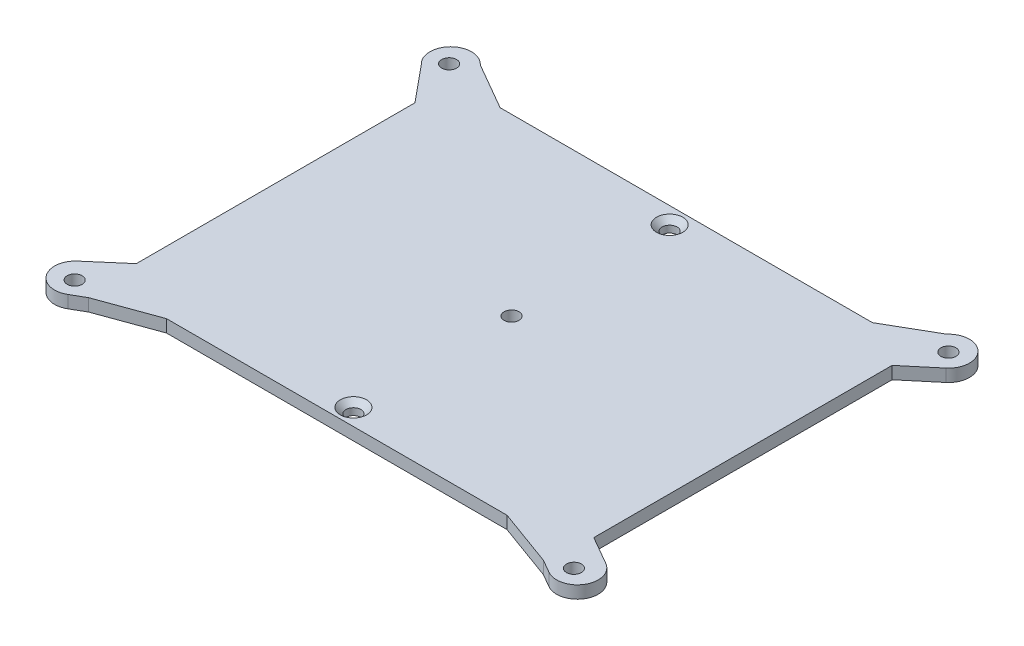
ISO-10303-21;
HEADER;
FILE_DESCRIPTION(('STEP AP214'),'2;1');
FILE_NAME('part.step','',(''),(''),'','','');
FILE_SCHEMA(('AUTOMOTIVE_DESIGN { 1 0 10303 214 1 1 1 1 }'));
ENDSEC;
DATA;
#1=APPLICATION_CONTEXT('core data for automotive mechanical design processes');
#2=APPLICATION_PROTOCOL_DEFINITION('international standard','automotive_design',2000,#1);
#3=PRODUCT_CONTEXT('',#1,'mechanical');
#4=PRODUCT('Part','Part','',(#3));
#5=PRODUCT_RELATED_PRODUCT_CATEGORY('part','',(#4));
#6=PRODUCT_DEFINITION_FORMATION('','',#4);
#7=PRODUCT_DEFINITION_CONTEXT('part definition',#1,'design');
#8=PRODUCT_DEFINITION('design','',#6,#7);
#9=PRODUCT_DEFINITION_SHAPE('','',#8);
#10=(LENGTH_UNIT() NAMED_UNIT(*) SI_UNIT(.MILLI.,.METRE.));
#11=(NAMED_UNIT(*) PLANE_ANGLE_UNIT() SI_UNIT($,.RADIAN.));
#12=(NAMED_UNIT(*) SI_UNIT($,.STERADIAN.) SOLID_ANGLE_UNIT());
#13=UNCERTAINTY_MEASURE_WITH_UNIT(LENGTH_MEASURE(1.E-05),#10,'distance_accuracy_value','');
#14=(GEOMETRIC_REPRESENTATION_CONTEXT(3) GLOBAL_UNCERTAINTY_ASSIGNED_CONTEXT((#13)) GLOBAL_UNIT_ASSIGNED_CONTEXT((#10,
#11,#12)) REPRESENTATION_CONTEXT('',''));
#15=CARTESIAN_POINT('',(0.,0.,0.));
#16=DIRECTION('',(0.,0.,1.));
#17=DIRECTION('',(1.,0.,0.));
#18=AXIS2_PLACEMENT_3D('',#15,#16,#17);
#19=CARTESIAN_POINT('',(0.,3.,0.));
#20=DIRECTION('',(0.,-1.,0.));
#21=DIRECTION('',(0.,0.,-1.));
#22=AXIS2_PLACEMENT_3D('',#19,#20,#21);
#23=PLANE('',#22);
#24=CARTESIAN_POINT('',(0.,3.,-38.));
#25=DIRECTION('',(0.,1.,0.));
#26=DIRECTION('',(0.,0.,1.));
#27=AXIS2_PLACEMENT_3D('',#24,#25,#26);
#28=CIRCLE('',#27,3.15);
#29=CARTESIAN_POINT('',(0.,3.,-34.85));
#30=VERTEX_POINT('',#29);
#31=EDGE_CURVE('E884',#30,#30,#28,.T.);
#32=ORIENTED_EDGE('',*,*,#31,.F.);
#33=EDGE_LOOP('',(#32));
#34=FACE_BOUND('',#33,.T.);
#35=CARTESIAN_POINT('',(0.,3.,38.));
#36=DIRECTION('',(0.,1.,0.));
#37=DIRECTION('',(0.,0.,1.));
#38=AXIS2_PLACEMENT_3D('',#35,#36,#37);
#39=CIRCLE('',#38,3.15);
#40=CARTESIAN_POINT('',(0.,3.,41.15));
#41=VERTEX_POINT('',#40);
#42=EDGE_CURVE('E348',#41,#41,#39,.T.);
#43=ORIENTED_EDGE('',*,*,#42,.F.);
#44=EDGE_LOOP('',(#43));
#45=FACE_BOUND('',#44,.T.);
#46=CARTESIAN_POINT('',(0.,3.,0.));
#47=DIRECTION('',(0.,1.,0.));
#48=DIRECTION('',(0.,0.,1.));
#49=AXIS2_PLACEMENT_3D('',#46,#47,#48);
#50=CIRCLE('',#49,1.8);
#51=CARTESIAN_POINT('',(0.,3.,1.8));
#52=VERTEX_POINT('',#51);
#53=EDGE_CURVE('E340',#52,#52,#50,.T.);
#54=ORIENTED_EDGE('',*,*,#53,.F.);
#55=EDGE_LOOP('',(#54));
#56=FACE_BOUND('',#55,.T.);
#57=CARTESIAN_POINT('',(-60.,3.,-45.));
#58=DIRECTION('',(0.,1.,0.));
#59=DIRECTION('',(0.,0.,1.));
#60=AXIS2_PLACEMENT_3D('',#57,#58,#59);
#61=CIRCLE('',#60,1.8);
#62=CARTESIAN_POINT('',(-60.,3.,-43.2));
#63=VERTEX_POINT('',#62);
#64=EDGE_CURVE('E358',#63,#63,#61,.T.);
#65=ORIENTED_EDGE('',*,*,#64,.F.);
#66=EDGE_LOOP('',(#65));
#67=FACE_BOUND('',#66,.T.);
#68=CARTESIAN_POINT('',(60.,3.,45.));
#69=DIRECTION('',(0.,1.,0.));
#70=DIRECTION('',(0.,0.,1.));
#71=AXIS2_PLACEMENT_3D('',#68,#69,#70);
#72=CIRCLE('',#71,1.8);
#73=CARTESIAN_POINT('',(60.,3.,46.8));
#74=VERTEX_POINT('',#73);
#75=EDGE_CURVE('E364',#74,#74,#72,.T.);
#76=ORIENTED_EDGE('',*,*,#75,.F.);
#77=EDGE_LOOP('',(#76));
#78=FACE_BOUND('',#77,.T.);
#79=CARTESIAN_POINT('',(-60.,3.,45.));
#80=DIRECTION('',(0.,1.,0.));
#81=DIRECTION('',(0.,0.,1.));
#82=AXIS2_PLACEMENT_3D('',#79,#80,#81);
#83=CIRCLE('',#82,1.8);
#84=CARTESIAN_POINT('',(-60.,3.,46.8));
#85=VERTEX_POINT('',#84);
#86=EDGE_CURVE('E336',#85,#85,#83,.T.);
#87=ORIENTED_EDGE('',*,*,#86,.F.);
#88=EDGE_LOOP('',(#87));
#89=FACE_BOUND('',#88,.T.);
#90=DIRECTION('',(-0.866025403784442,0.,-0.499999999999995));
#91=VECTOR('',#90,1.);
#92=CARTESIAN_POINT('',(48.9737205583711,3.,32.1698729810779));
#93=LINE('',#92,#91);
#94=CARTESIAN_POINT('',(62.8301270189222,3.,40.1698729810778));
#95=VERTEX_POINT('',#94);
#96=CARTESIAN_POINT('',(56.,3.,36.2264973081038));
#97=VERTEX_POINT('',#96);
#98=EDGE_CURVE('E184',#95,#97,#93,.T.);
#99=ORIENTED_EDGE('',*,*,#98,.T.);
#100=DIRECTION('',(0.,0.,-1.));
#101=VECTOR('',#100,1.);
#102=CARTESIAN_POINT('',(56.,3.,42.));
#103=LINE('',#102,#101);
#104=CARTESIAN_POINT('',(56.,3.,-35.4729635533386));
#105=VERTEX_POINT('',#104);
#106=EDGE_CURVE('E267',#97,#105,#103,.T.);
#107=ORIENTED_EDGE('',*,*,#106,.T.);
#108=DIRECTION('',(0.766044443118976,0.,-0.642787609686542));
#109=VECTOR('',#108,1.);
#110=CARTESIAN_POINT('',(50.787449174124,3.,-31.0991140778532));
#111=LINE('',#110,#109);
#112=CARTESIAN_POINT('',(63.0441602640276,3.,-41.3837158328378));
#113=VERTEX_POINT('',#112);
#114=EDGE_CURVE('E224',#105,#113,#111,.T.);
#115=ORIENTED_EDGE('',*,*,#114,.T.);
#116=CARTESIAN_POINT('',(59.8302222155949,3.,-45.2139380484327));
#117=DIRECTION('',(0.,1.,0.));
#118=DIRECTION('',(0.,0.,-1.));
#119=AXIS2_PLACEMENT_3D('',#116,#117,#118);
#120=CIRCLE('',#119,5.);
#121=CARTESIAN_POINT('',(56.6162841671621,3.,-49.0441602640276));
#122=VERTEX_POINT('',#121);
#123=EDGE_CURVE('E221',#113,#122,#120,.T.);
#124=ORIENTED_EDGE('',*,*,#123,.T.);
#125=DIRECTION('',(-0.766044443118973,0.,0.642787609686545));
#126=VECTOR('',#125,1.);
#127=CARTESIAN_POINT('',(44.3595730772586,3.,-38.7595585090429));
#128=LINE('',#127,#126);
#129=CARTESIAN_POINT('',(55.8818252968878,3.,-48.4278760968655));
#130=VERTEX_POINT('',#129);
#131=EDGE_CURVE('E218',#122,#130,#128,.T.);
#132=ORIENTED_EDGE('',*,*,#131,.T.);
#133=DIRECTION('',(0.866025403784438,0.,-0.500000000000002));
#134=VECTOR('',#133,1.);
#135=CARTESIAN_POINT('',(-6.99942915138335,3.,-12.1233669141746));
#136=LINE('',#135,#134);
#137=CARTESIAN_POINT('',(44.7484173123593,3.,-42.));
#138=VERTEX_POINT('',#137);
#139=EDGE_CURVE('E325',#130,#138,#136,.F.);
#140=ORIENTED_EDGE('',*,*,#139,.T.);
#141=DIRECTION('',(-1.,0.,0.));
#142=VECTOR('',#141,1.);
#143=CARTESIAN_POINT('',(-56.,3.,-42.));
#144=LINE('',#143,#142);
#145=CARTESIAN_POINT('',(-44.7484173123593,3.,-42.));
#146=VERTEX_POINT('',#145);
#147=EDGE_CURVE('E269',#138,#146,#144,.T.);
#148=ORIENTED_EDGE('',*,*,#147,.T.);
#149=DIRECTION('',(-0.866025403784438,0.,-0.500000000000001));
#150=VECTOR('',#149,1.);
#151=CARTESIAN_POINT('',(6.99942915138337,3.,-12.1233669141747));
#152=LINE('',#151,#150);
#153=CARTESIAN_POINT('',(-55.8818252968878,3.,-48.4278760968655));
#154=VERTEX_POINT('',#153);
#155=EDGE_CURVE('E297',#146,#154,#152,.T.);
#156=ORIENTED_EDGE('',*,*,#155,.T.);
#157=DIRECTION('',(0.766044443118973,0.,0.642787609686545));
#158=VECTOR('',#157,1.);
#159=CARTESIAN_POINT('',(-44.3595730772586,3.,-38.7595585090429));
#160=LINE('',#159,#158);
#161=CARTESIAN_POINT('',(-56.6162841671621,3.,-49.0441602640276));
#162=VERTEX_POINT('',#161);
#163=EDGE_CURVE('E256',#162,#154,#160,.T.);
#164=ORIENTED_EDGE('',*,*,#163,.F.);
#165=CARTESIAN_POINT('',(-59.8302222155949,3.,-45.2139380484327));
#166=DIRECTION('',(0.,-1.,0.));
#167=DIRECTION('',(0.,0.,-1.));
#168=AXIS2_PLACEMENT_3D('',#165,#166,#167);
#169=CIRCLE('',#168,5.);
#170=CARTESIAN_POINT('',(-63.2263038604296,3.,-41.544247399125));
#171=VERTEX_POINT('',#170);
#172=EDGE_CURVE('E254',#171,#162,#169,.T.);
#173=ORIENTED_EDGE('',*,*,#172,.F.);
#174=DIRECTION('',(0.636920264158959,0.,0.770929683631187));
#175=VECTOR('',#174,1.);
#176=CARTESIAN_POINT('',(-17.178365107074,3.,14.1922785879535));
#177=LINE('',#176,#175);
#178=CARTESIAN_POINT('',(-56.,3.,-32.7975133690809));
#179=VERTEX_POINT('',#178);
#180=EDGE_CURVE('E318',#171,#179,#177,.T.);
#181=ORIENTED_EDGE('',*,*,#180,.T.);
#182=DIRECTION('',(0.,0.,1.));
#183=VECTOR('',#182,1.);
#184=CARTESIAN_POINT('',(-56.,3.,42.));
#185=LINE('',#184,#183);
#186=CARTESIAN_POINT('',(-56.,3.,34.1736987454082));
#187=VERTEX_POINT('',#186);
#188=EDGE_CURVE('E272',#179,#187,#185,.T.);
#189=ORIENTED_EDGE('',*,*,#188,.T.);
#190=DIRECTION('',(0.757734837258502,0.,-0.652562576619922));
#191=VECTOR('',#190,1.);
#192=CARTESIAN_POINT('',(-6.94907507956374,3.,-8.06904420076361));
#193=LINE('',#192,#191);
#194=CARTESIAN_POINT('',(-63.5134693843119,3.,40.6443118143819));
#195=VERTEX_POINT('',#194);
#196=EDGE_CURVE('E292',#187,#195,#193,.F.);
#197=ORIENTED_EDGE('',*,*,#196,.T.);
#198=CARTESIAN_POINT('',(-60.3301270189222,3.,44.5));
#199=DIRECTION('',(0.,-1.,0.));
#200=DIRECTION('',(0.,0.,-1.));
#201=AXIS2_PLACEMENT_3D('',#198,#199,#200);
#202=CIRCLE('',#201,5.);
#203=CARTESIAN_POINT('',(-57.8301270189222,3.,48.8301270189222));
#204=VERTEX_POINT('',#203);
#205=EDGE_CURVE('E243',#204,#195,#202,.T.);
#206=ORIENTED_EDGE('',*,*,#205,.F.);
#207=DIRECTION('',(-0.866025403784441,0.,0.499999999999995));
#208=VECTOR('',#207,1.);
#209=CARTESIAN_POINT('',(-43.9737205583712,3.,40.8301270189223));
#210=LINE('',#209,#208);
#211=CARTESIAN_POINT('',(-54.6602540378441,3.,46.9999999999999));
#212=VERTEX_POINT('',#211);
#213=EDGE_CURVE('E248',#212,#204,#210,.T.);
#214=ORIENTED_EDGE('',*,*,#213,.F.);
#215=DIRECTION('',(0.939692620785911,0.,-0.34202014332566));
#216=VECTOR('',#215,1.);
#217=CARTESIAN_POINT('',(8.71147374129264,3.,23.9345773943741));
#218=LINE('',#217,#216);
#219=CARTESIAN_POINT('',(-40.922866940571,3.,42.));
#220=VERTEX_POINT('',#219);
#221=EDGE_CURVE('E314',#212,#220,#218,.T.);
#222=ORIENTED_EDGE('',*,*,#221,.T.);
#223=DIRECTION('',(1.,0.,0.));
#224=VECTOR('',#223,1.);
#225=CARTESIAN_POINT('',(-56.,3.,42.));
#226=LINE('',#225,#224);
#227=CARTESIAN_POINT('',(40.922866940571,3.,42.));
#228=VERTEX_POINT('',#227);
#229=EDGE_CURVE('E274',#220,#228,#226,.T.);
#230=ORIENTED_EDGE('',*,*,#229,.T.);
#231=DIRECTION('',(-0.939692620785912,0.,-0.342020143325659));
#232=VECTOR('',#231,1.);
#233=CARTESIAN_POINT('',(-8.71147374129264,3.,23.9345773943742));
#234=LINE('',#233,#232);
#235=CARTESIAN_POINT('',(54.6602540378441,3.,46.9999999999998));
#236=VERTEX_POINT('',#235);
#237=EDGE_CURVE('E11',#228,#236,#234,.F.);
#238=ORIENTED_EDGE('',*,*,#237,.T.);
#239=DIRECTION('',(0.866025403784441,0.,0.499999999999995));
#240=VECTOR('',#239,1.);
#241=CARTESIAN_POINT('',(43.9737205583712,3.,40.8301270189223));
#242=LINE('',#241,#240);
#243=CARTESIAN_POINT('',(57.8301270189222,3.,48.8301270189222));
#244=VERTEX_POINT('',#243);
#245=EDGE_CURVE('E186',#236,#244,#242,.T.);
#246=ORIENTED_EDGE('',*,*,#245,.T.);
#247=CARTESIAN_POINT('',(60.3301270189222,3.,44.5));
#248=DIRECTION('',(0.,1.,0.));
#249=DIRECTION('',(0.,0.,-1.));
#250=AXIS2_PLACEMENT_3D('',#247,#248,#249);
#251=CIRCLE('',#250,5.);
#252=EDGE_CURVE('E180',#244,#95,#251,.T.);
#253=ORIENTED_EDGE('',*,*,#252,.T.);
#254=EDGE_LOOP('',(#99,#107,#115,#124,#132,#140,#148,#156,#164,#173,#181,#189,#197,#206,#214,
#222,#230,#238,#246,#253));
#255=FACE_BOUND('',#254,.T.);
#256=CARTESIAN_POINT('',(60.,3.,-45.));
#257=DIRECTION('',(0.,1.,0.));
#258=DIRECTION('',(0.,0.,1.));
#259=AXIS2_PLACEMENT_3D('',#256,#257,#258);
#260=CIRCLE('',#259,1.8);
#261=CARTESIAN_POINT('',(60.,3.,-43.2));
#262=VERTEX_POINT('',#261);
#263=EDGE_CURVE('E337',#262,#262,#260,.T.);
#264=ORIENTED_EDGE('',*,*,#263,.F.);
#265=EDGE_LOOP('',(#264));
#266=FACE_BOUND('',#265,.T.);
#267=ADVANCED_FACE('F40',(#34,#45,#56,#67,#78,#89,#255,#266),#23,.F.);
#268=CARTESIAN_POINT('',(56.,3.,42.));
#269=DIRECTION('',(-1.,0.,0.));
#270=DIRECTION('',(0.,0.,1.));
#271=AXIS2_PLACEMENT_3D('',#268,#269,#270);
#272=PLANE('',#271);
#273=DIRECTION('',(0.,1.,0.));
#274=VECTOR('',#273,1.);
#275=CARTESIAN_POINT('',(56.,3.,36.2264973081038));
#276=LINE('',#275,#274);
#277=CARTESIAN_POINT('',(56.,0.,36.2264973081038));
#278=VERTEX_POINT('',#277);
#279=EDGE_CURVE('E203',#278,#97,#276,.T.);
#280=ORIENTED_EDGE('',*,*,#279,.F.);
#281=DIRECTION('',(0.,0.,-1.));
#282=VECTOR('',#281,1.);
#283=CARTESIAN_POINT('',(56.,0.,42.));
#284=LINE('',#283,#282);
#285=CARTESIAN_POINT('',(56.,0.,-35.4729635533386));
#286=VERTEX_POINT('',#285);
#287=EDGE_CURVE('E266',#278,#286,#284,.T.);
#288=ORIENTED_EDGE('',*,*,#287,.T.);
#289=DIRECTION('',(0.,-1.,0.));
#290=VECTOR('',#289,1.);
#291=CARTESIAN_POINT('',(56.,3.,-35.4729635533386));
#292=LINE('',#291,#290);
#293=EDGE_CURVE('E235',#105,#286,#292,.T.);
#294=ORIENTED_EDGE('',*,*,#293,.F.);
#295=ORIENTED_EDGE('',*,*,#106,.F.);
#296=EDGE_LOOP('',(#280,#288,#294,#295));
#297=FACE_BOUND('',#296,.T.);
#298=ADVANCED_FACE('F390',(#297),#272,.F.);
#299=CARTESIAN_POINT('',(-56.,3.,42.));
#300=DIRECTION('',(0.,0.,-1.));
#301=DIRECTION('',(-1.,0.,0.));
#302=AXIS2_PLACEMENT_3D('',#299,#300,#301);
#303=PLANE('',#302);
#304=DIRECTION('',(1.,0.,0.));
#305=VECTOR('',#304,1.);
#306=CARTESIAN_POINT('',(-56.,0.,42.));
#307=LINE('',#306,#305);
#308=CARTESIAN_POINT('',(-40.922866940571,0.,42.));
#309=VERTEX_POINT('',#308);
#310=CARTESIAN_POINT('',(40.922866940571,0.,42.));
#311=VERTEX_POINT('',#310);
#312=EDGE_CURVE('E270',#309,#311,#307,.T.);
#313=ORIENTED_EDGE('',*,*,#312,.T.);
#314=DIRECTION('',(0.,1.,0.));
#315=VECTOR('',#314,1.);
#316=CARTESIAN_POINT('',(40.922866940571,3.,42.));
#317=LINE('',#316,#315);
#318=EDGE_CURVE('E64',#311,#228,#317,.T.);
#319=ORIENTED_EDGE('',*,*,#318,.T.);
#320=ORIENTED_EDGE('',*,*,#229,.F.);
#321=DIRECTION('',(0.,-1.,0.));
#322=VECTOR('',#321,1.);
#323=CARTESIAN_POINT('',(-40.922866940571,3.,42.));
#324=LINE('',#323,#322);
#325=EDGE_CURVE('E302',#220,#309,#324,.T.);
#326=ORIENTED_EDGE('',*,*,#325,.T.);
#327=EDGE_LOOP('',(#313,#319,#320,#326));
#328=FACE_BOUND('',#327,.T.);
#329=ADVANCED_FACE('F454',(#328),#303,.F.);
#330=CARTESIAN_POINT('',(-56.,3.,-42.));
#331=DIRECTION('',(0.,0.,1.));
#332=DIRECTION('',(1.,0.,0.));
#333=AXIS2_PLACEMENT_3D('',#330,#331,#332);
#334=PLANE('',#333);
#335=ORIENTED_EDGE('',*,*,#147,.F.);
#336=DIRECTION('',(0.,-1.,0.));
#337=VECTOR('',#336,1.);
#338=CARTESIAN_POINT('',(44.7484173123593,0.,-42.));
#339=LINE('',#338,#337);
#340=CARTESIAN_POINT('',(44.7484173123593,0.,-42.));
#341=VERTEX_POINT('',#340);
#342=EDGE_CURVE('E323',#138,#341,#339,.T.);
#343=ORIENTED_EDGE('',*,*,#342,.T.);
#344=DIRECTION('',(-1.,0.,0.));
#345=VECTOR('',#344,1.);
#346=CARTESIAN_POINT('',(-56.,0.,-42.));
#347=LINE('',#346,#345);
#348=CARTESIAN_POINT('',(-44.7484173123593,0.,-42.));
#349=VERTEX_POINT('',#348);
#350=EDGE_CURVE('E278',#341,#349,#347,.T.);
#351=ORIENTED_EDGE('',*,*,#350,.T.);
#352=DIRECTION('',(0.,1.,0.));
#353=VECTOR('',#352,1.);
#354=CARTESIAN_POINT('',(-44.7484173123593,3.,-42.));
#355=LINE('',#354,#353);
#356=EDGE_CURVE('E287',#349,#146,#355,.T.);
#357=ORIENTED_EDGE('',*,*,#356,.T.);
#358=EDGE_LOOP('',(#335,#343,#351,#357));
#359=FACE_BOUND('',#358,.T.);
#360=ADVANCED_FACE('F411',(#359),#334,.F.);
#361=CARTESIAN_POINT('',(-56.,3.,42.));
#362=DIRECTION('',(1.,0.,0.));
#363=DIRECTION('',(0.,0.,-1.));
#364=AXIS2_PLACEMENT_3D('',#361,#362,#363);
#365=PLANE('',#364);
#366=ORIENTED_EDGE('',*,*,#188,.F.);
#367=DIRECTION('',(0.,-1.,0.));
#368=VECTOR('',#367,1.);
#369=CARTESIAN_POINT('',(-56.,3.,-32.7975133690809));
#370=LINE('',#369,#368);
#371=CARTESIAN_POINT('',(-56.,0.,-32.7975133690809));
#372=VERTEX_POINT('',#371);
#373=EDGE_CURVE('E307',#179,#372,#370,.T.);
#374=ORIENTED_EDGE('',*,*,#373,.T.);
#375=DIRECTION('',(0.,0.,1.));
#376=VECTOR('',#375,1.);
#377=CARTESIAN_POINT('',(-56.,0.,42.));
#378=LINE('',#377,#376);
#379=CARTESIAN_POINT('',(-56.,0.,34.1736987454082));
#380=VERTEX_POINT('',#379);
#381=EDGE_CURVE('E280',#372,#380,#378,.T.);
#382=ORIENTED_EDGE('',*,*,#381,.T.);
#383=DIRECTION('',(0.,1.,0.));
#384=VECTOR('',#383,1.);
#385=CARTESIAN_POINT('',(-56.,3.,34.1736987454082));
#386=LINE('',#385,#384);
#387=EDGE_CURVE('E276',#380,#187,#386,.T.);
#388=ORIENTED_EDGE('',*,*,#387,.T.);
#389=EDGE_LOOP('',(#366,#374,#382,#388));
#390=FACE_BOUND('',#389,.T.);
#391=ADVANCED_FACE('F382',(#390),#365,.F.);
#392=CARTESIAN_POINT('',(0.,0.,0.));
#393=DIRECTION('',(0.,-1.,0.));
#394=DIRECTION('',(0.,0.,-1.));
#395=AXIS2_PLACEMENT_3D('',#392,#393,#394);
#396=PLANE('',#395);
#397=CARTESIAN_POINT('',(0.,0.,-38.));
#398=DIRECTION('',(0.,-1.,0.));
#399=DIRECTION('',(0.,0.,-1.));
#400=AXIS2_PLACEMENT_3D('',#397,#398,#399);
#401=CIRCLE('',#400,1.79999999999999);
#402=CARTESIAN_POINT('',(0.,0.,-39.8));
#403=VERTEX_POINT('',#402);
#404=EDGE_CURVE('E45',#403,#403,#401,.T.);
#405=ORIENTED_EDGE('',*,*,#404,.F.);
#406=EDGE_LOOP('',(#405));
#407=FACE_BOUND('',#406,.T.);
#408=CARTESIAN_POINT('',(0.,0.,38.));
#409=DIRECTION('',(0.,-1.,0.));
#410=DIRECTION('',(0.,0.,-1.));
#411=AXIS2_PLACEMENT_3D('',#408,#409,#410);
#412=CIRCLE('',#411,1.79999999999999);
#413=CARTESIAN_POINT('',(0.,0.,36.2));
#414=VERTEX_POINT('',#413);
#415=EDGE_CURVE('E338',#414,#414,#412,.T.);
#416=ORIENTED_EDGE('',*,*,#415,.F.);
#417=EDGE_LOOP('',(#416));
#418=FACE_BOUND('',#417,.T.);
#419=CARTESIAN_POINT('',(0.,0.,0.));
#420=DIRECTION('',(0.,-1.,0.));
#421=DIRECTION('',(0.,0.,-1.));
#422=AXIS2_PLACEMENT_3D('',#419,#420,#421);
#423=CIRCLE('',#422,1.8);
#424=CARTESIAN_POINT('',(0.,0.,-1.8));
#425=VERTEX_POINT('',#424);
#426=EDGE_CURVE('E345',#425,#425,#423,.T.);
#427=ORIENTED_EDGE('',*,*,#426,.F.);
#428=EDGE_LOOP('',(#427));
#429=FACE_BOUND('',#428,.T.);
#430=CARTESIAN_POINT('',(-60.,0.,-45.));
#431=DIRECTION('',(0.,-1.,0.));
#432=DIRECTION('',(0.,0.,-1.));
#433=AXIS2_PLACEMENT_3D('',#430,#431,#432);
#434=CIRCLE('',#433,1.8);
#435=CARTESIAN_POINT('',(-60.,0.,-46.8));
#436=VERTEX_POINT('',#435);
#437=EDGE_CURVE('E361',#436,#436,#434,.T.);
#438=ORIENTED_EDGE('',*,*,#437,.F.);
#439=EDGE_LOOP('',(#438));
#440=FACE_BOUND('',#439,.T.);
#441=CARTESIAN_POINT('',(60.,0.,45.));
#442=DIRECTION('',(0.,-1.,0.));
#443=DIRECTION('',(0.,0.,-1.));
#444=AXIS2_PLACEMENT_3D('',#441,#442,#443);
#445=CIRCLE('',#444,1.8);
#446=CARTESIAN_POINT('',(60.,0.,43.2));
#447=VERTEX_POINT('',#446);
#448=EDGE_CURVE('E367',#447,#447,#445,.T.);
#449=ORIENTED_EDGE('',*,*,#448,.F.);
#450=EDGE_LOOP('',(#449));
#451=FACE_BOUND('',#450,.T.);
#452=CARTESIAN_POINT('',(60.,0.,-45.));
#453=DIRECTION('',(0.,-1.,0.));
#454=DIRECTION('',(0.,0.,-1.));
#455=AXIS2_PLACEMENT_3D('',#452,#453,#454);
#456=CIRCLE('',#455,1.8);
#457=CARTESIAN_POINT('',(60.,0.,-46.8));
#458=VERTEX_POINT('',#457);
#459=EDGE_CURVE('E334',#458,#458,#456,.T.);
#460=ORIENTED_EDGE('',*,*,#459,.F.);
#461=EDGE_LOOP('',(#460));
#462=FACE_BOUND('',#461,.T.);
#463=CARTESIAN_POINT('',(-60.,0.,45.));
#464=DIRECTION('',(0.,-1.,0.));
#465=DIRECTION('',(0.,0.,-1.));
#466=AXIS2_PLACEMENT_3D('',#463,#464,#465);
#467=CIRCLE('',#466,1.8);
#468=CARTESIAN_POINT('',(-60.,0.,43.2));
#469=VERTEX_POINT('',#468);
#470=EDGE_CURVE('E208',#469,#469,#467,.T.);
#471=ORIENTED_EDGE('',*,*,#470,.F.);
#472=EDGE_LOOP('',(#471));
#473=FACE_BOUND('',#472,.T.);
#474=ORIENTED_EDGE('',*,*,#287,.F.);
#475=DIRECTION('',(-0.866025403784442,0.,-0.499999999999995));
#476=VECTOR('',#475,1.);
#477=CARTESIAN_POINT('',(48.9737205583711,0.,32.1698729810779));
#478=LINE('',#477,#476);
#479=CARTESIAN_POINT('',(62.8301270189222,0.,40.1698729810778));
#480=VERTEX_POINT('',#479);
#481=EDGE_CURVE('E212',#480,#278,#478,.T.);
#482=ORIENTED_EDGE('',*,*,#481,.F.);
#483=CARTESIAN_POINT('',(60.3301270189222,0.,44.5));
#484=DIRECTION('',(0.,1.,0.));
#485=DIRECTION('',(0.,0.,-1.));
#486=AXIS2_PLACEMENT_3D('',#483,#484,#485);
#487=CIRCLE('',#486,5.);
#488=CARTESIAN_POINT('',(57.8301270189222,0.,48.8301270189222));
#489=VERTEX_POINT('',#488);
#490=EDGE_CURVE('E195',#489,#480,#487,.T.);
#491=ORIENTED_EDGE('',*,*,#490,.F.);
#492=DIRECTION('',(0.866025403784441,0.,0.499999999999995));
#493=VECTOR('',#492,1.);
#494=CARTESIAN_POINT('',(43.9737205583712,0.,40.8301270189223));
#495=LINE('',#494,#493);
#496=CARTESIAN_POINT('',(54.6602540378441,0.,46.9999999999998));
#497=VERTEX_POINT('',#496);
#498=EDGE_CURVE('E204',#497,#489,#495,.T.);
#499=ORIENTED_EDGE('',*,*,#498,.F.);
#500=DIRECTION('',(0.939692620785912,0.,0.342020143325659));
#501=VECTOR('',#500,1.);
#502=CARTESIAN_POINT('',(54.6602540378441,0.,46.9999999999998));
#503=LINE('',#502,#501);
#504=EDGE_CURVE('E50',#497,#311,#503,.F.);
#505=ORIENTED_EDGE('',*,*,#504,.T.);
#506=ORIENTED_EDGE('',*,*,#312,.F.);
#507=DIRECTION('',(-0.939692620785911,0.,0.34202014332566));
#508=VECTOR('',#507,1.);
#509=CARTESIAN_POINT('',(-40.922866940571,0.,42.));
#510=LINE('',#509,#508);
#511=CARTESIAN_POINT('',(-54.6602540378441,0.,46.9999999999999));
#512=VERTEX_POINT('',#511);
#513=EDGE_CURVE('E312',#309,#512,#510,.T.);
#514=ORIENTED_EDGE('',*,*,#513,.T.);
#515=DIRECTION('',(-0.866025403784441,0.,0.499999999999995));
#516=VECTOR('',#515,1.);
#517=CARTESIAN_POINT('',(-43.9737205583712,0.,40.8301270189223));
#518=LINE('',#517,#516);
#519=CARTESIAN_POINT('',(-57.8301270189222,0.,48.8301270189222));
#520=VERTEX_POINT('',#519);
#521=EDGE_CURVE('E247',#512,#520,#518,.T.);
#522=ORIENTED_EDGE('',*,*,#521,.T.);
#523=CARTESIAN_POINT('',(-60.3301270189222,0.,44.5));
#524=DIRECTION('',(0.,-1.,0.));
#525=DIRECTION('',(0.,0.,-1.));
#526=AXIS2_PLACEMENT_3D('',#523,#524,#525);
#527=CIRCLE('',#526,5.);
#528=CARTESIAN_POINT('',(-63.5134693843119,0.,40.6443118143819));
#529=VERTEX_POINT('',#528);
#530=EDGE_CURVE('E244',#520,#529,#527,.T.);
#531=ORIENTED_EDGE('',*,*,#530,.T.);
#532=DIRECTION('',(-0.757734837258502,0.,0.652562576619922));
#533=VECTOR('',#532,1.);
#534=CARTESIAN_POINT('',(-56.,0.,34.1736987454082));
#535=LINE('',#534,#533);
#536=EDGE_CURVE('E294',#529,#380,#535,.F.);
#537=ORIENTED_EDGE('',*,*,#536,.T.);
#538=ORIENTED_EDGE('',*,*,#381,.F.);
#539=DIRECTION('',(-0.636920264158959,0.,-0.770929683631187));
#540=VECTOR('',#539,1.);
#541=CARTESIAN_POINT('',(-56.,0.,-32.7975133690809));
#542=LINE('',#541,#540);
#543=CARTESIAN_POINT('',(-63.2263038604296,0.,-41.544247399125));
#544=VERTEX_POINT('',#543);
#545=EDGE_CURVE('E316',#372,#544,#542,.T.);
#546=ORIENTED_EDGE('',*,*,#545,.T.);
#547=CARTESIAN_POINT('',(-59.8302222155949,0.,-45.2139380484327));
#548=DIRECTION('',(0.,-1.,0.));
#549=DIRECTION('',(0.,0.,-1.));
#550=AXIS2_PLACEMENT_3D('',#547,#548,#549);
#551=CIRCLE('',#550,5.);
#552=CARTESIAN_POINT('',(-56.6162841671621,0.,-49.0441602640276));
#553=VERTEX_POINT('',#552);
#554=EDGE_CURVE('E250',#544,#553,#551,.T.);
#555=ORIENTED_EDGE('',*,*,#554,.T.);
#556=DIRECTION('',(0.766044443118973,0.,0.642787609686545));
#557=VECTOR('',#556,1.);
#558=CARTESIAN_POINT('',(-44.3595730772586,0.,-38.7595585090429));
#559=LINE('',#558,#557);
#560=CARTESIAN_POINT('',(-55.8818252968878,0.,-48.4278760968655));
#561=VERTEX_POINT('',#560);
#562=EDGE_CURVE('E257',#553,#561,#559,.T.);
#563=ORIENTED_EDGE('',*,*,#562,.T.);
#564=DIRECTION('',(0.866025403784438,0.,0.500000000000001));
#565=VECTOR('',#564,1.);
#566=CARTESIAN_POINT('',(-44.7484173123593,0.,-42.));
#567=LINE('',#566,#565);
#568=EDGE_CURVE('E299',#561,#349,#567,.T.);
#569=ORIENTED_EDGE('',*,*,#568,.T.);
#570=ORIENTED_EDGE('',*,*,#350,.F.);
#571=DIRECTION('',(-0.866025403784438,0.,0.500000000000002));
#572=VECTOR('',#571,1.);
#573=CARTESIAN_POINT('',(55.8818252968878,0.,-48.4278760968655));
#574=LINE('',#573,#572);
#575=CARTESIAN_POINT('',(55.8818252968878,0.,-48.4278760968655));
#576=VERTEX_POINT('',#575);
#577=EDGE_CURVE('E327',#341,#576,#574,.F.);
#578=ORIENTED_EDGE('',*,*,#577,.T.);
#579=DIRECTION('',(-0.766044443118973,0.,0.642787609686545));
#580=VECTOR('',#579,1.);
#581=CARTESIAN_POINT('',(44.3595730772586,0.,-38.7595585090429));
#582=LINE('',#581,#580);
#583=CARTESIAN_POINT('',(56.6162841671621,0.,-49.0441602640276));
#584=VERTEX_POINT('',#583);
#585=EDGE_CURVE('E217',#584,#576,#582,.T.);
#586=ORIENTED_EDGE('',*,*,#585,.F.);
#587=CARTESIAN_POINT('',(59.8302222155949,0.,-45.2139380484327));
#588=DIRECTION('',(0.,1.,0.));
#589=DIRECTION('',(0.,0.,-1.));
#590=AXIS2_PLACEMENT_3D('',#587,#588,#589);
#591=CIRCLE('',#590,5.);
#592=CARTESIAN_POINT('',(63.0441602640276,0.,-41.3837158328378));
#593=VERTEX_POINT('',#592);
#594=EDGE_CURVE('E229',#593,#584,#591,.T.);
#595=ORIENTED_EDGE('',*,*,#594,.F.);
#596=DIRECTION('',(0.766044443118976,0.,-0.642787609686542));
#597=VECTOR('',#596,1.);
#598=CARTESIAN_POINT('',(50.787449174124,0.,-31.0991140778532));
#599=LINE('',#598,#597);
#600=EDGE_CURVE('E222',#286,#593,#599,.T.);
#601=ORIENTED_EDGE('',*,*,#600,.F.);
#602=EDGE_LOOP('',(#474,#482,#491,#499,#505,#506,#514,#522,#531,#537,#538,#546,#555,#563,#569,
#570,#578,#586,#595,#601));
#603=FACE_BOUND('',#602,.T.);
#604=ADVANCED_FACE('F379',(#407,#418,#429,#440,#451,#462,#473,#603),#396,.T.);
#605=CARTESIAN_POINT('',(-44.3595730772586,3.,-38.7595585090429));
#606=DIRECTION('',(0.642787609686545,0.,-0.766044443118973));
#607=DIRECTION('',(-0.766044443118973,0.,-0.642787609686545));
#608=AXIS2_PLACEMENT_3D('',#605,#606,#607);
#609=PLANE('',#608);
#610=ORIENTED_EDGE('',*,*,#163,.T.);
#611=DIRECTION('',(0.,-1.,0.));
#612=VECTOR('',#611,1.);
#613=CARTESIAN_POINT('',(-55.8818252968878,3.,-48.4278760968655));
#614=LINE('',#613,#612);
#615=EDGE_CURVE('E290',#154,#561,#614,.T.);
#616=ORIENTED_EDGE('',*,*,#615,.T.);
#617=ORIENTED_EDGE('',*,*,#562,.F.);
#618=DIRECTION('',(0.,-1.,0.));
#619=VECTOR('',#618,1.);
#620=CARTESIAN_POINT('',(-56.6162841671621,3.,-49.0441602640276));
#621=LINE('',#620,#619);
#622=EDGE_CURVE('E260',#162,#553,#621,.T.);
#623=ORIENTED_EDGE('',*,*,#622,.F.);
#624=EDGE_LOOP('',(#610,#616,#617,#623));
#625=FACE_BOUND('',#624,.T.);
#626=ADVANCED_FACE('F381',(#625),#609,.T.);
#627=CARTESIAN_POINT('',(-59.8302222155949,3.,-45.2139380484327));
#628=DIRECTION('',(0.,-1.,0.));
#629=DIRECTION('',(0.,0.,-1.));
#630=AXIS2_PLACEMENT_3D('',#627,#628,#629);
#631=CYLINDRICAL_SURFACE('',#630,5.);
#632=ORIENTED_EDGE('',*,*,#554,.F.);
#633=DIRECTION('',(0.,-1.,0.));
#634=VECTOR('',#633,1.);
#635=CARTESIAN_POINT('',(-63.2263038604296,3.,-41.544247399125));
#636=LINE('',#635,#634);
#637=EDGE_CURVE('E310',#544,#171,#636,.F.);
#638=ORIENTED_EDGE('',*,*,#637,.T.);
#639=ORIENTED_EDGE('',*,*,#172,.T.);
#640=ORIENTED_EDGE('',*,*,#622,.T.);
#641=EDGE_LOOP('',(#632,#638,#639,#640));
#642=FACE_BOUND('',#641,.T.);
#643=ADVANCED_FACE('F425',(#642),#631,.T.);
#644=CARTESIAN_POINT('',(-43.9737205583712,3.,40.8301270189223));
#645=DIRECTION('',(0.499999999999995,0.,0.866025403784441));
#646=DIRECTION('',(0.866025403784441,0.,-0.499999999999995));
#647=AXIS2_PLACEMENT_3D('',#644,#645,#646);
#648=PLANE('',#647);
#649=ORIENTED_EDGE('',*,*,#521,.F.);
#650=DIRECTION('',(0.,1.,0.));
#651=VECTOR('',#650,1.);
#652=CARTESIAN_POINT('',(-54.6602540378441,3.,46.9999999999999));
#653=LINE('',#652,#651);
#654=EDGE_CURVE('E305',#512,#212,#653,.T.);
#655=ORIENTED_EDGE('',*,*,#654,.T.);
#656=ORIENTED_EDGE('',*,*,#213,.T.);
#657=DIRECTION('',(0.,-1.,0.));
#658=VECTOR('',#657,1.);
#659=CARTESIAN_POINT('',(-57.8301270189222,3.,48.8301270189222));
#660=LINE('',#659,#658);
#661=EDGE_CURVE('E240',#204,#520,#660,.T.);
#662=ORIENTED_EDGE('',*,*,#661,.T.);
#663=EDGE_LOOP('',(#649,#655,#656,#662));
#664=FACE_BOUND('',#663,.T.);
#665=ADVANCED_FACE('F448',(#664),#648,.T.);
#666=CARTESIAN_POINT('',(-60.3301270189222,3.,44.5));
#667=DIRECTION('',(0.,-1.,0.));
#668=DIRECTION('',(0.,0.,-1.));
#669=AXIS2_PLACEMENT_3D('',#666,#667,#668);
#670=CYLINDRICAL_SURFACE('',#669,5.);
#671=ORIENTED_EDGE('',*,*,#205,.T.);
#672=DIRECTION('',(0.,-1.,0.));
#673=VECTOR('',#672,1.);
#674=CARTESIAN_POINT('',(-63.5134693843119,3.,40.6443118143819));
#675=LINE('',#674,#673);
#676=EDGE_CURVE('E285',#195,#529,#675,.T.);
#677=ORIENTED_EDGE('',*,*,#676,.T.);
#678=ORIENTED_EDGE('',*,*,#530,.F.);
#679=ORIENTED_EDGE('',*,*,#661,.F.);
#680=EDGE_LOOP('',(#671,#677,#678,#679));
#681=FACE_BOUND('',#680,.T.);
#682=ADVANCED_FACE('F445',(#681),#670,.T.);
#683=CARTESIAN_POINT('',(-56.,3.,34.1736987454082));
#684=DIRECTION('',(-0.652562576619922,0.,-0.757734837258502));
#685=DIRECTION('',(0.,-1.,0.));
#686=AXIS2_PLACEMENT_3D('',#683,#684,#685);
#687=PLANE('',#686);
#688=ORIENTED_EDGE('',*,*,#536,.F.);
#689=ORIENTED_EDGE('',*,*,#676,.F.);
#690=ORIENTED_EDGE('',*,*,#196,.F.);
#691=ORIENTED_EDGE('',*,*,#387,.F.);
#692=EDGE_LOOP('',(#688,#689,#690,#691));
#693=FACE_BOUND('',#692,.T.);
#694=ADVANCED_FACE('F440',(#693),#687,.T.);
#695=CARTESIAN_POINT('',(-44.7484173123593,3.,-42.));
#696=DIRECTION('',(-0.500000000000001,0.,0.866025403784438));
#697=DIRECTION('',(0.,1.,0.));
#698=AXIS2_PLACEMENT_3D('',#695,#696,#697);
#699=PLANE('',#698);
#700=ORIENTED_EDGE('',*,*,#568,.F.);
#701=ORIENTED_EDGE('',*,*,#615,.F.);
#702=ORIENTED_EDGE('',*,*,#155,.F.);
#703=ORIENTED_EDGE('',*,*,#356,.F.);
#704=EDGE_LOOP('',(#700,#701,#702,#703));
#705=FACE_BOUND('',#704,.T.);
#706=ADVANCED_FACE('F416',(#705),#699,.F.);
#707=CARTESIAN_POINT('',(-40.922866940571,3.,42.));
#708=DIRECTION('',(-0.34202014332566,0.,-0.939692620785911));
#709=DIRECTION('',(0.,-1.,0.));
#710=AXIS2_PLACEMENT_3D('',#707,#708,#709);
#711=PLANE('',#710);
#712=ORIENTED_EDGE('',*,*,#221,.F.);
#713=ORIENTED_EDGE('',*,*,#654,.F.);
#714=ORIENTED_EDGE('',*,*,#513,.F.);
#715=ORIENTED_EDGE('',*,*,#325,.F.);
#716=EDGE_LOOP('',(#712,#713,#714,#715));
#717=FACE_BOUND('',#716,.T.);
#718=ADVANCED_FACE('F453',(#717),#711,.F.);
#719=CARTESIAN_POINT('',(-56.,3.,-32.7975133690809));
#720=DIRECTION('',(0.770929683631187,0.,-0.636920264158959));
#721=DIRECTION('',(0.,-1.,0.));
#722=AXIS2_PLACEMENT_3D('',#719,#720,#721);
#723=PLANE('',#722);
#724=ORIENTED_EDGE('',*,*,#180,.F.);
#725=ORIENTED_EDGE('',*,*,#637,.F.);
#726=ORIENTED_EDGE('',*,*,#545,.F.);
#727=ORIENTED_EDGE('',*,*,#373,.F.);
#728=EDGE_LOOP('',(#724,#725,#726,#727));
#729=FACE_BOUND('',#728,.T.);
#730=ADVANCED_FACE('F431',(#729),#723,.F.);
#731=CARTESIAN_POINT('',(50.787449174124,3.,-31.0991140778532));
#732=DIRECTION('',(-0.642787609686542,0.,-0.766044443118976));
#733=DIRECTION('',(-0.766044443118976,0.,0.642787609686542));
#734=AXIS2_PLACEMENT_3D('',#731,#732,#733);
#735=PLANE('',#734);
#736=ORIENTED_EDGE('',*,*,#114,.F.);
#737=ORIENTED_EDGE('',*,*,#293,.T.);
#738=ORIENTED_EDGE('',*,*,#600,.T.);
#739=DIRECTION('',(0.,-1.,0.));
#740=VECTOR('',#739,1.);
#741=CARTESIAN_POINT('',(63.0441602640276,3.,-41.3837158328378));
#742=LINE('',#741,#740);
#743=EDGE_CURVE('E232',#113,#593,#742,.T.);
#744=ORIENTED_EDGE('',*,*,#743,.F.);
#745=EDGE_LOOP('',(#736,#737,#738,#744));
#746=FACE_BOUND('',#745,.T.);
#747=ADVANCED_FACE('F393',(#746),#735,.F.);
#748=CARTESIAN_POINT('',(44.3595730772586,3.,-38.7595585090429));
#749=DIRECTION('',(0.642787609686545,0.,0.766044443118973));
#750=DIRECTION('',(0.766044443118973,0.,-0.642787609686545));
#751=AXIS2_PLACEMENT_3D('',#748,#749,#750);
#752=PLANE('',#751);
#753=ORIENTED_EDGE('',*,*,#585,.T.);
#754=DIRECTION('',(0.,1.,0.));
#755=VECTOR('',#754,1.);
#756=CARTESIAN_POINT('',(55.8818252968878,3.,-48.4278760968655));
#757=LINE('',#756,#755);
#758=EDGE_CURVE('E320',#576,#130,#757,.T.);
#759=ORIENTED_EDGE('',*,*,#758,.T.);
#760=ORIENTED_EDGE('',*,*,#131,.F.);
#761=DIRECTION('',(0.,-1.,0.));
#762=VECTOR('',#761,1.);
#763=CARTESIAN_POINT('',(56.6162841671621,3.,-49.0441602640276));
#764=LINE('',#763,#762);
#765=EDGE_CURVE('E226',#122,#584,#764,.T.);
#766=ORIENTED_EDGE('',*,*,#765,.T.);
#767=EDGE_LOOP('',(#753,#759,#760,#766));
#768=FACE_BOUND('',#767,.T.);
#769=ADVANCED_FACE('F402',(#768),#752,.F.);
#770=CARTESIAN_POINT('',(59.8302222155949,3.,-45.2139380484327));
#771=DIRECTION('',(0.,-1.,0.));
#772=DIRECTION('',(0.,0.,-1.));
#773=AXIS2_PLACEMENT_3D('',#770,#771,#772);
#774=CYLINDRICAL_SURFACE('',#773,5.);
#775=ORIENTED_EDGE('',*,*,#594,.T.);
#776=ORIENTED_EDGE('',*,*,#765,.F.);
#777=ORIENTED_EDGE('',*,*,#123,.F.);
#778=ORIENTED_EDGE('',*,*,#743,.T.);
#779=EDGE_LOOP('',(#775,#776,#777,#778));
#780=FACE_BOUND('',#779,.T.);
#781=ADVANCED_FACE('F399',(#780),#774,.T.);
#782=CARTESIAN_POINT('',(43.9737205583712,3.,40.8301270189223));
#783=DIRECTION('',(0.499999999999995,0.,-0.866025403784441));
#784=DIRECTION('',(-0.866025403784441,0.,-0.499999999999995));
#785=AXIS2_PLACEMENT_3D('',#782,#783,#784);
#786=PLANE('',#785);
#787=ORIENTED_EDGE('',*,*,#245,.F.);
#788=DIRECTION('',(0.,-1.,0.));
#789=VECTOR('',#788,1.);
#790=CARTESIAN_POINT('',(54.6602540378441,0.,46.9999999999998));
#791=LINE('',#790,#789);
#792=EDGE_CURVE('E329',#236,#497,#791,.T.);
#793=ORIENTED_EDGE('',*,*,#792,.T.);
#794=ORIENTED_EDGE('',*,*,#498,.T.);
#795=DIRECTION('',(0.,-1.,0.));
#796=VECTOR('',#795,1.);
#797=CARTESIAN_POINT('',(57.8301270189222,3.,48.8301270189222));
#798=LINE('',#797,#796);
#799=EDGE_CURVE('E199',#244,#489,#798,.T.);
#800=ORIENTED_EDGE('',*,*,#799,.F.);
#801=EDGE_LOOP('',(#787,#793,#794,#800));
#802=FACE_BOUND('',#801,.T.);
#803=ADVANCED_FACE('F459',(#802),#786,.F.);
#804=CARTESIAN_POINT('',(48.9737205583711,3.,32.1698729810779));
#805=DIRECTION('',(-0.499999999999995,0.,0.866025403784442));
#806=DIRECTION('',(0.866025403784442,0.,0.499999999999995));
#807=AXIS2_PLACEMENT_3D('',#804,#805,#806);
#808=PLANE('',#807);
#809=ORIENTED_EDGE('',*,*,#481,.T.);
#810=ORIENTED_EDGE('',*,*,#279,.T.);
#811=ORIENTED_EDGE('',*,*,#98,.F.);
#812=DIRECTION('',(0.,-1.,0.));
#813=VECTOR('',#812,1.);
#814=CARTESIAN_POINT('',(62.8301270189222,3.,40.1698729810778));
#815=LINE('',#814,#813);
#816=EDGE_CURVE('E192',#95,#480,#815,.T.);
#817=ORIENTED_EDGE('',*,*,#816,.T.);
#818=EDGE_LOOP('',(#809,#810,#811,#817));
#819=FACE_BOUND('',#818,.T.);
#820=ADVANCED_FACE('F202',(#819),#808,.F.);
#821=CARTESIAN_POINT('',(60.3301270189222,3.,44.5));
#822=DIRECTION('',(0.,-1.,0.));
#823=DIRECTION('',(0.,0.,-1.));
#824=AXIS2_PLACEMENT_3D('',#821,#822,#823);
#825=CYLINDRICAL_SURFACE('',#824,5.);
#826=ORIENTED_EDGE('',*,*,#490,.T.);
#827=ORIENTED_EDGE('',*,*,#816,.F.);
#828=ORIENTED_EDGE('',*,*,#252,.F.);
#829=ORIENTED_EDGE('',*,*,#799,.T.);
#830=EDGE_LOOP('',(#826,#827,#828,#829));
#831=FACE_BOUND('',#830,.T.);
#832=ADVANCED_FACE('F193',(#831),#825,.T.);
#833=CARTESIAN_POINT('',(55.8818252968878,3.,-48.4278760968655));
#834=DIRECTION('',(-0.500000000000002,0.,-0.866025403784438));
#835=DIRECTION('',(0.,-1.,0.));
#836=AXIS2_PLACEMENT_3D('',#833,#834,#835);
#837=PLANE('',#836);
#838=ORIENTED_EDGE('',*,*,#577,.F.);
#839=ORIENTED_EDGE('',*,*,#342,.F.);
#840=ORIENTED_EDGE('',*,*,#139,.F.);
#841=ORIENTED_EDGE('',*,*,#758,.F.);
#842=EDGE_LOOP('',(#838,#839,#840,#841));
#843=FACE_BOUND('',#842,.T.);
#844=ADVANCED_FACE('F406',(#843),#837,.T.);
#845=CARTESIAN_POINT('',(54.6602540378441,3.,46.9999999999998));
#846=DIRECTION('',(-0.342020143325659,0.,0.939692620785912));
#847=DIRECTION('',(0.,1.,0.));
#848=AXIS2_PLACEMENT_3D('',#845,#846,#847);
#849=PLANE('',#848);
#850=ORIENTED_EDGE('',*,*,#237,.F.);
#851=ORIENTED_EDGE('',*,*,#318,.F.);
#852=ORIENTED_EDGE('',*,*,#504,.F.);
#853=ORIENTED_EDGE('',*,*,#792,.F.);
#854=EDGE_LOOP('',(#850,#851,#852,#853));
#855=FACE_BOUND('',#854,.T.);
#856=ADVANCED_FACE('F43',(#855),#849,.T.);
#857=CARTESIAN_POINT('',(-60.,3.,45.));
#858=DIRECTION('',(0.,1.,0.));
#859=DIRECTION('',(0.,0.,1.));
#860=AXIS2_PLACEMENT_3D('',#857,#858,#859);
#861=CYLINDRICAL_SURFACE('',#860,1.8);
#862=ORIENTED_EDGE('',*,*,#470,.T.);
#863=EDGE_LOOP('',(#862));
#864=FACE_BOUND('',#863,.T.);
#865=ORIENTED_EDGE('',*,*,#86,.T.);
#866=EDGE_LOOP('',(#865));
#867=FACE_BOUND('',#866,.T.);
#868=ADVANCED_FACE('F377',(#864,#867),#861,.F.);
#869=CARTESIAN_POINT('',(60.,3.,-45.));
#870=DIRECTION('',(0.,1.,0.));
#871=DIRECTION('',(0.,0.,1.));
#872=AXIS2_PLACEMENT_3D('',#869,#870,#871);
#873=CYLINDRICAL_SURFACE('',#872,1.8);
#874=ORIENTED_EDGE('',*,*,#459,.T.);
#875=EDGE_LOOP('',(#874));
#876=FACE_BOUND('',#875,.T.);
#877=ORIENTED_EDGE('',*,*,#263,.T.);
#878=EDGE_LOOP('',(#877));
#879=FACE_BOUND('',#878,.T.);
#880=ADVANCED_FACE('F600',(#876,#879),#873,.F.);
#881=CARTESIAN_POINT('',(60.,3.,45.));
#882=DIRECTION('',(0.,1.,0.));
#883=DIRECTION('',(0.,0.,1.));
#884=AXIS2_PLACEMENT_3D('',#881,#882,#883);
#885=CYLINDRICAL_SURFACE('',#884,1.8);
#886=ORIENTED_EDGE('',*,*,#448,.T.);
#887=EDGE_LOOP('',(#886));
#888=FACE_BOUND('',#887,.T.);
#889=ORIENTED_EDGE('',*,*,#75,.T.);
#890=EDGE_LOOP('',(#889));
#891=FACE_BOUND('',#890,.T.);
#892=ADVANCED_FACE('F608',(#888,#891),#885,.F.);
#893=CARTESIAN_POINT('',(-60.,3.,-45.));
#894=DIRECTION('',(0.,1.,0.));
#895=DIRECTION('',(0.,0.,1.));
#896=AXIS2_PLACEMENT_3D('',#893,#894,#895);
#897=CYLINDRICAL_SURFACE('',#896,1.8);
#898=ORIENTED_EDGE('',*,*,#437,.T.);
#899=EDGE_LOOP('',(#898));
#900=FACE_BOUND('',#899,.T.);
#901=ORIENTED_EDGE('',*,*,#64,.T.);
#902=EDGE_LOOP('',(#901));
#903=FACE_BOUND('',#902,.T.);
#904=ADVANCED_FACE('F618',(#900,#903),#897,.F.);
#905=CARTESIAN_POINT('',(0.,3.,0.));
#906=DIRECTION('',(0.,1.,0.));
#907=DIRECTION('',(0.,0.,1.));
#908=AXIS2_PLACEMENT_3D('',#905,#906,#907);
#909=CYLINDRICAL_SURFACE('',#908,1.8);
#910=ORIENTED_EDGE('',*,*,#426,.T.);
#911=EDGE_LOOP('',(#910));
#912=FACE_BOUND('',#911,.T.);
#913=ORIENTED_EDGE('',*,*,#53,.T.);
#914=EDGE_LOOP('',(#913));
#915=FACE_BOUND('',#914,.T.);
#916=ADVANCED_FACE('F628',(#912,#915),#909,.F.);
#917=CARTESIAN_POINT('',(0.,3.,38.));
#918=DIRECTION('',(0.,1.,0.));
#919=DIRECTION('',(0.,0.,1.));
#920=AXIS2_PLACEMENT_3D('',#917,#918,#919);
#921=CYLINDRICAL_SURFACE('',#920,1.79999999999999);
#922=ORIENTED_EDGE('',*,*,#415,.T.);
#923=EDGE_LOOP('',(#922));
#924=FACE_BOUND('',#923,.T.);
#925=CARTESIAN_POINT('',(0.,1.65,38.));
#926=DIRECTION('',(0.,1.,0.));
#927=DIRECTION('',(0.,0.,1.));
#928=AXIS2_PLACEMENT_3D('',#925,#926,#927);
#929=CIRCLE('',#928,1.79999999999999);
#930=CARTESIAN_POINT('',(0.,1.65,39.8));
#931=VERTEX_POINT('',#930);
#932=EDGE_CURVE('E341',#931,#931,#929,.T.);
#933=ORIENTED_EDGE('',*,*,#932,.T.);
#934=EDGE_LOOP('',(#933));
#935=FACE_BOUND('',#934,.T.);
#936=ADVANCED_FACE('F638',(#924,#935),#921,.F.);
#937=CARTESIAN_POINT('',(0.,3.,38.));
#938=DIRECTION('',(0.,1.,0.));
#939=DIRECTION('',(0.,0.,1.));
#940=AXIS2_PLACEMENT_3D('',#937,#938,#939);
#941=CONICAL_SURFACE('',#940,3.15,0.785398163397451);
#942=ORIENTED_EDGE('',*,*,#932,.F.);
#943=EDGE_LOOP('',(#942));
#944=FACE_BOUND('',#943,.T.);
#945=ORIENTED_EDGE('',*,*,#42,.T.);
#946=EDGE_LOOP('',(#945));
#947=FACE_BOUND('',#946,.T.);
#948=ADVANCED_FACE('F649',(#944,#947),#941,.F.);
#949=CARTESIAN_POINT('',(0.,3.,-38.));
#950=DIRECTION('',(0.,1.,0.));
#951=DIRECTION('',(0.,0.,1.));
#952=AXIS2_PLACEMENT_3D('',#949,#950,#951);
#953=CYLINDRICAL_SURFACE('',#952,1.79999999999999);
#954=ORIENTED_EDGE('',*,*,#404,.T.);
#955=EDGE_LOOP('',(#954));
#956=FACE_BOUND('',#955,.T.);
#957=CARTESIAN_POINT('',(0.,1.65,-38.));
#958=DIRECTION('',(0.,1.,0.));
#959=DIRECTION('',(0.,0.,1.));
#960=AXIS2_PLACEMENT_3D('',#957,#958,#959);
#961=CIRCLE('',#960,1.79999999999999);
#962=CARTESIAN_POINT('',(0.,1.65,-36.2));
#963=VERTEX_POINT('',#962);
#964=EDGE_CURVE('E882',#963,#963,#961,.T.);
#965=ORIENTED_EDGE('',*,*,#964,.T.);
#966=EDGE_LOOP('',(#965));
#967=FACE_BOUND('',#966,.T.);
#968=ADVANCED_FACE('F659',(#956,#967),#953,.F.);
#969=CARTESIAN_POINT('',(0.,3.,-38.));
#970=DIRECTION('',(0.,1.,0.));
#971=DIRECTION('',(0.,0.,1.));
#972=AXIS2_PLACEMENT_3D('',#969,#970,#971);
#973=CONICAL_SURFACE('',#972,3.15,0.785398163397451);
#974=ORIENTED_EDGE('',*,*,#964,.F.);
#975=EDGE_LOOP('',(#974));
#976=FACE_BOUND('',#975,.T.);
#977=ORIENTED_EDGE('',*,*,#31,.T.);
#978=EDGE_LOOP('',(#977));
#979=FACE_BOUND('',#978,.T.);
#980=ADVANCED_FACE('F669',(#976,#979),#973,.F.);
#981=CLOSED_SHELL('',(#267,#298,#329,#360,#391,#604,#626,#643,#665,#682,#694,#706,#718,#730,
#747,#769,#781,#803,#820,#832,#844,#856,#868,#880,#892,#904,#916,#936,#948,#968,#980));
#982=MANIFOLD_SOLID_BREP('B2',#981);
#983=ADVANCED_BREP_SHAPE_REPRESENTATION('',(#18,#982),#14);
#984=SHAPE_DEFINITION_REPRESENTATION(#9,#983);
ENDSEC;
END-ISO-10303-21;
